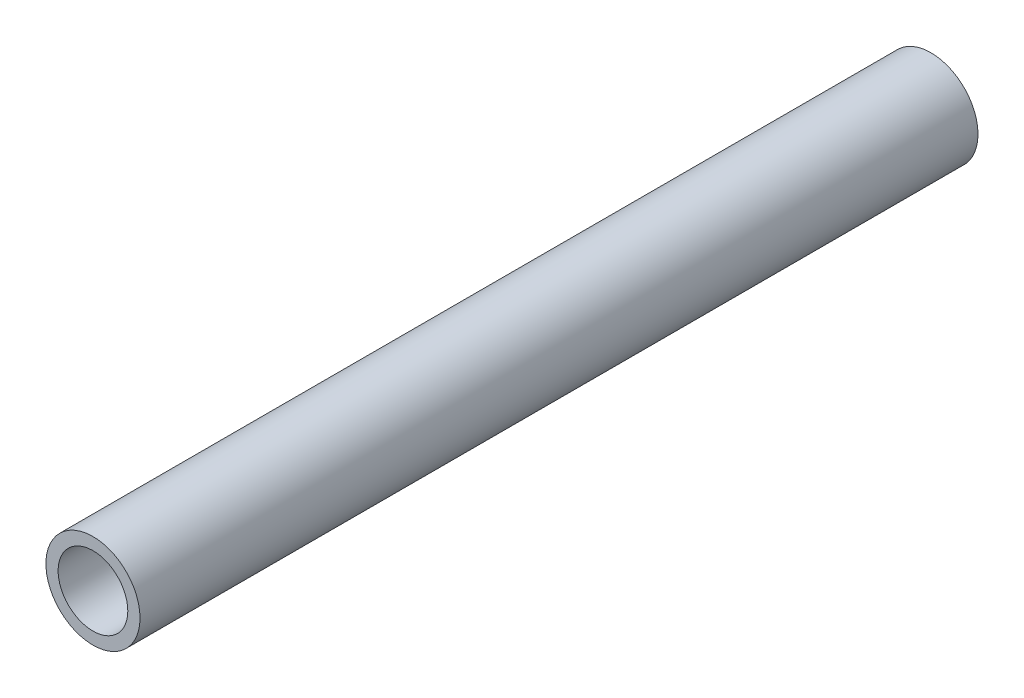
ISO-10303-21;
HEADER;
FILE_DESCRIPTION(('STEP AP214'),'2;1');
FILE_NAME('part.step','',(''),(''),'','','');
FILE_SCHEMA(('AUTOMOTIVE_DESIGN { 1 0 10303 214 1 1 1 1 }'));
ENDSEC;
DATA;
#1=APPLICATION_CONTEXT('core data for automotive mechanical design processes');
#2=APPLICATION_PROTOCOL_DEFINITION('international standard','automotive_design',2000,#1);
#3=PRODUCT_CONTEXT('',#1,'mechanical');
#4=PRODUCT('Part','Part','',(#3));
#5=PRODUCT_RELATED_PRODUCT_CATEGORY('part','',(#4));
#6=PRODUCT_DEFINITION_FORMATION('','',#4);
#7=PRODUCT_DEFINITION_CONTEXT('part definition',#1,'design');
#8=PRODUCT_DEFINITION('design','',#6,#7);
#9=PRODUCT_DEFINITION_SHAPE('','',#8);
#10=(LENGTH_UNIT() NAMED_UNIT(*) SI_UNIT(.MILLI.,.METRE.));
#11=(NAMED_UNIT(*) PLANE_ANGLE_UNIT() SI_UNIT($,.RADIAN.));
#12=(NAMED_UNIT(*) SI_UNIT($,.STERADIAN.) SOLID_ANGLE_UNIT());
#13=UNCERTAINTY_MEASURE_WITH_UNIT(LENGTH_MEASURE(1.E-05),#10,'distance_accuracy_value','');
#14=(GEOMETRIC_REPRESENTATION_CONTEXT(3) GLOBAL_UNCERTAINTY_ASSIGNED_CONTEXT((#13)) GLOBAL_UNIT_ASSIGNED_CONTEXT((#10,
#11,#12)) REPRESENTATION_CONTEXT('',''));
#15=CARTESIAN_POINT('',(0.,0.,0.));
#16=DIRECTION('',(0.,0.,1.));
#17=DIRECTION('',(1.,0.,0.));
#18=AXIS2_PLACEMENT_3D('',#15,#16,#17);
#19=CARTESIAN_POINT('',(0.,0.,95.));
#20=DIRECTION('',(0.,0.,1.));
#21=DIRECTION('',(1.,0.,0.));
#22=AXIS2_PLACEMENT_3D('',#19,#20,#21);
#23=PLANE('',#22);
#24=CARTESIAN_POINT('',(0.,0.,95.));
#25=DIRECTION('',(0.,0.,1.));
#26=DIRECTION('',(1.,0.,0.));
#27=AXIS2_PLACEMENT_3D('',#24,#25,#26);
#28=CIRCLE('',#27,10.668);
#29=CARTESIAN_POINT('',(10.668,0.,95.));
#30=VERTEX_POINT('',#29);
#31=EDGE_CURVE('E11',#30,#30,#28,.T.);
#32=ORIENTED_EDGE('',*,*,#31,.T.);
#33=EDGE_LOOP('',(#32));
#34=FACE_BOUND('',#33,.T.);
#35=CARTESIAN_POINT('',(0.,0.,95.));
#36=DIRECTION('',(0.,0.,1.));
#37=DIRECTION('',(1.,0.,0.));
#38=AXIS2_PLACEMENT_3D('',#35,#36,#37);
#39=CIRCLE('',#38,7.8994);
#40=CARTESIAN_POINT('',(7.8994,0.,95.));
#41=VERTEX_POINT('',#40);
#42=EDGE_CURVE('E56',#41,#41,#39,.T.);
#43=ORIENTED_EDGE('',*,*,#42,.F.);
#44=EDGE_LOOP('',(#43));
#45=FACE_BOUND('',#44,.T.);
#46=ADVANCED_FACE('F43',(#34,#45),#23,.T.);
#47=CARTESIAN_POINT('',(0.,0.,-95.));
#48=DIRECTION('',(0.,0.,1.));
#49=DIRECTION('',(1.,0.,0.));
#50=AXIS2_PLACEMENT_3D('',#47,#48,#49);
#51=PLANE('',#50);
#52=CARTESIAN_POINT('',(0.,0.,-95.));
#53=DIRECTION('',(0.,0.,1.));
#54=DIRECTION('',(1.,0.,0.));
#55=AXIS2_PLACEMENT_3D('',#52,#53,#54);
#56=CIRCLE('',#55,10.668);
#57=CARTESIAN_POINT('',(10.668,0.,-95.));
#58=VERTEX_POINT('',#57);
#59=EDGE_CURVE('E47',#58,#58,#56,.T.);
#60=ORIENTED_EDGE('',*,*,#59,.F.);
#61=EDGE_LOOP('',(#60));
#62=FACE_BOUND('',#61,.T.);
#63=CARTESIAN_POINT('',(0.,0.,-95.));
#64=DIRECTION('',(0.,0.,1.));
#65=DIRECTION('',(1.,0.,0.));
#66=AXIS2_PLACEMENT_3D('',#63,#64,#65);
#67=CIRCLE('',#66,7.8994);
#68=CARTESIAN_POINT('',(7.8994,0.,-95.));
#69=VERTEX_POINT('',#68);
#70=EDGE_CURVE('E58',#69,#69,#67,.T.);
#71=ORIENTED_EDGE('',*,*,#70,.T.);
#72=EDGE_LOOP('',(#71));
#73=FACE_BOUND('',#72,.T.);
#74=ADVANCED_FACE('F70',(#62,#73),#51,.F.);
#75=CARTESIAN_POINT('',(0.,0.,95.));
#76=DIRECTION('',(0.,0.,-1.));
#77=DIRECTION('',(-1.,0.,0.));
#78=AXIS2_PLACEMENT_3D('',#75,#76,#77);
#79=CYLINDRICAL_SURFACE('',#78,10.668);
#80=ORIENTED_EDGE('',*,*,#31,.F.);
#81=EDGE_LOOP('',(#80));
#82=FACE_BOUND('',#81,.T.);
#83=ORIENTED_EDGE('',*,*,#59,.T.);
#84=EDGE_LOOP('',(#83));
#85=FACE_BOUND('',#84,.T.);
#86=ADVANCED_FACE('F45',(#82,#85),#79,.T.);
#87=CARTESIAN_POINT('',(0.,0.,95.));
#88=DIRECTION('',(0.,0.,-1.));
#89=DIRECTION('',(-1.,0.,0.));
#90=AXIS2_PLACEMENT_3D('',#87,#88,#89);
#91=CYLINDRICAL_SURFACE('',#90,7.8994);
#92=ORIENTED_EDGE('',*,*,#42,.T.);
#93=EDGE_LOOP('',(#92));
#94=FACE_BOUND('',#93,.T.);
#95=ORIENTED_EDGE('',*,*,#70,.F.);
#96=EDGE_LOOP('',(#95));
#97=FACE_BOUND('',#96,.T.);
#98=ADVANCED_FACE('F66',(#94,#97),#91,.F.);
#99=CLOSED_SHELL('',(#46,#74,#86,#98));
#100=MANIFOLD_SOLID_BREP('B2',#99);
#101=ADVANCED_BREP_SHAPE_REPRESENTATION('',(#18,#100),#14);
#102=SHAPE_DEFINITION_REPRESENTATION(#9,#101);
ENDSEC;
END-ISO-10303-21;
